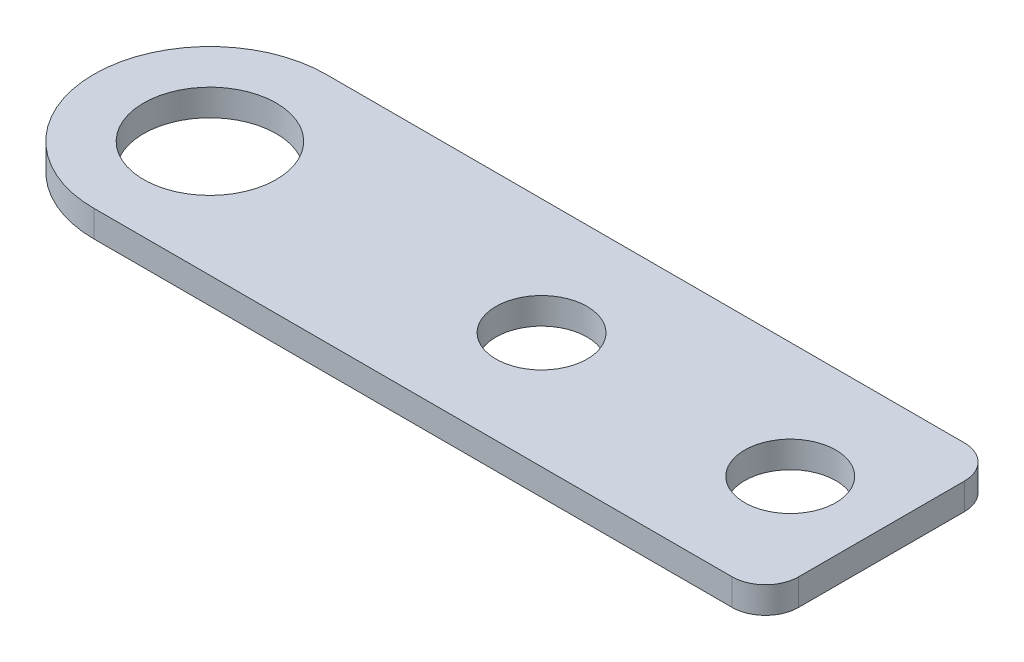
ISO-10303-21;
HEADER;
FILE_DESCRIPTION(('STEP AP214'),'2;1');
FILE_NAME('part.step','',(''),(''),'','','');
FILE_SCHEMA(('AUTOMOTIVE_DESIGN { 1 0 10303 214 1 1 1 1 }'));
ENDSEC;
DATA;
#1=APPLICATION_CONTEXT('core data for automotive mechanical design processes');
#2=APPLICATION_PROTOCOL_DEFINITION('international standard','automotive_design',2000,#1);
#3=PRODUCT_CONTEXT('',#1,'mechanical');
#4=PRODUCT('Part','Part','',(#3));
#5=PRODUCT_RELATED_PRODUCT_CATEGORY('part','',(#4));
#6=PRODUCT_DEFINITION_FORMATION('','',#4);
#7=PRODUCT_DEFINITION_CONTEXT('part definition',#1,'design');
#8=PRODUCT_DEFINITION('design','',#6,#7);
#9=PRODUCT_DEFINITION_SHAPE('','',#8);
#10=(LENGTH_UNIT() NAMED_UNIT(*) SI_UNIT(.MILLI.,.METRE.));
#11=(NAMED_UNIT(*) PLANE_ANGLE_UNIT() SI_UNIT($,.RADIAN.));
#12=(NAMED_UNIT(*) SI_UNIT($,.STERADIAN.) SOLID_ANGLE_UNIT());
#13=UNCERTAINTY_MEASURE_WITH_UNIT(LENGTH_MEASURE(1.E-05),#10,'distance_accuracy_value','');
#14=(GEOMETRIC_REPRESENTATION_CONTEXT(3) GLOBAL_UNCERTAINTY_ASSIGNED_CONTEXT((#13)) GLOBAL_UNIT_ASSIGNED_CONTEXT((#10,
#11,#12)) REPRESENTATION_CONTEXT('',''));
#15=CARTESIAN_POINT('',(0.,0.,0.));
#16=DIRECTION('',(0.,0.,1.));
#17=DIRECTION('',(1.,0.,0.));
#18=AXIS2_PLACEMENT_3D('',#15,#16,#17);
#19=CARTESIAN_POINT('',(-7.67572044652005,0.8,-7.00000000000001));
#20=DIRECTION('',(0.,1.,0.));
#21=DIRECTION('',(0.,0.,1.));
#22=AXIS2_PLACEMENT_3D('',#19,#20,#21);
#23=PLANE('',#22);
#24=CARTESIAN_POINT('',(0.,0.800000000000004,0.));
#25=DIRECTION('',(0.,-1.,0.));
#26=DIRECTION('',(0.,0.,-1.));
#27=AXIS2_PLACEMENT_3D('',#24,#25,#26);
#28=CIRCLE('',#27,3.99999999999999);
#29=CARTESIAN_POINT('',(0.,0.800000000000004,-3.99999999999999));
#30=VERTEX_POINT('',#29);
#31=EDGE_CURVE('E248',#30,#30,#28,.T.);
#32=ORIENTED_EDGE('',*,*,#31,.T.);
#33=EDGE_LOOP('',(#32));
#34=FACE_BOUND('',#33,.T.);
#35=CARTESIAN_POINT('',(35.,0.800000000000004,0.));
#36=DIRECTION('',(0.,-1.,0.));
#37=DIRECTION('',(0.,0.,-1.));
#38=AXIS2_PLACEMENT_3D('',#35,#36,#37);
#39=CIRCLE('',#38,2.74999999999999);
#40=CARTESIAN_POINT('',(35.,0.800000000000004,-2.74999999999999));
#41=VERTEX_POINT('',#40);
#42=EDGE_CURVE('E241',#41,#41,#39,.T.);
#43=ORIENTED_EDGE('',*,*,#42,.T.);
#44=EDGE_LOOP('',(#43));
#45=FACE_BOUND('',#44,.T.);
#46=DIRECTION('',(-1.,0.,0.));
#47=VECTOR('',#46,1.);
#48=CARTESIAN_POINT('',(38.5,0.8,7.));
#49=LINE('',#48,#47);
#50=CARTESIAN_POINT('',(0.,0.8,7.));
#51=VERTEX_POINT('',#50);
#52=CARTESIAN_POINT('',(38.4999999999998,0.8,7.));
#53=VERTEX_POINT('',#52);
#54=EDGE_CURVE('E149',#51,#53,#49,.F.);
#55=ORIENTED_EDGE('',*,*,#54,.T.);
#56=CARTESIAN_POINT('',(38.4999999999998,0.8,4.99999999999985));
#57=DIRECTION('',(0.,1.,0.));
#58=DIRECTION('',(0.,0.,1.));
#59=AXIS2_PLACEMENT_3D('',#56,#57,#58);
#60=CIRCLE('',#59,2.00000000000015);
#61=CARTESIAN_POINT('',(40.5,0.8,4.99999999999984));
#62=VERTEX_POINT('',#61);
#63=EDGE_CURVE('E54',#53,#62,#60,.T.);
#64=ORIENTED_EDGE('',*,*,#63,.T.);
#65=DIRECTION('',(0.,0.,1.));
#66=VECTOR('',#65,1.);
#67=CARTESIAN_POINT('',(40.5,0.8,-4.99999999999996));
#68=LINE('',#67,#66);
#69=CARTESIAN_POINT('',(40.5,0.8,-4.99999999999984));
#70=VERTEX_POINT('',#69);
#71=EDGE_CURVE('E148',#62,#70,#68,.F.);
#72=ORIENTED_EDGE('',*,*,#71,.T.);
#73=CARTESIAN_POINT('',(38.4999999999998,0.8,-4.99999999999984));
#74=DIRECTION('',(0.,1.,0.));
#75=DIRECTION('',(0.,0.,1.));
#76=AXIS2_PLACEMENT_3D('',#73,#74,#75);
#77=CIRCLE('',#76,2.00000000000015);
#78=CARTESIAN_POINT('',(38.4999999999998,0.8,-7.));
#79=VERTEX_POINT('',#78);
#80=EDGE_CURVE('E61',#70,#79,#77,.T.);
#81=ORIENTED_EDGE('',*,*,#80,.T.);
#82=DIRECTION('',(1.,0.,0.));
#83=VECTOR('',#82,1.);
#84=CARTESIAN_POINT('',(0.,0.8,-7.));
#85=LINE('',#84,#83);
#86=CARTESIAN_POINT('',(0.,0.8,-7.));
#87=VERTEX_POINT('',#86);
#88=EDGE_CURVE('E122',#79,#87,#85,.F.);
#89=ORIENTED_EDGE('',*,*,#88,.T.);
#90=CARTESIAN_POINT('',(0.,0.8,0.));
#91=DIRECTION('',(0.,-1.,0.));
#92=DIRECTION('',(0.,0.,1.));
#93=AXIS2_PLACEMENT_3D('',#90,#91,#92);
#94=CIRCLE('',#93,7.);
#95=EDGE_CURVE('E126',#87,#51,#94,.F.);
#96=ORIENTED_EDGE('',*,*,#95,.T.);
#97=EDGE_LOOP('',(#55,#64,#72,#81,#89,#96));
#98=FACE_BOUND('',#97,.T.);
#99=CARTESIAN_POINT('',(20.,0.800000000000004,0.));
#100=DIRECTION('',(0.,-1.,0.));
#101=DIRECTION('',(0.,0.,-1.));
#102=AXIS2_PLACEMENT_3D('',#99,#100,#101);
#103=CIRCLE('',#102,2.74999999999999);
#104=CARTESIAN_POINT('',(20.,0.800000000000004,-2.74999999999999));
#105=VERTEX_POINT('',#104);
#106=EDGE_CURVE('E110',#105,#105,#103,.T.);
#107=ORIENTED_EDGE('',*,*,#106,.T.);
#108=EDGE_LOOP('',(#107));
#109=FACE_BOUND('',#108,.T.);
#110=ADVANCED_FACE('F46',(#34,#45,#98,#109),#23,.T.);
#111=CARTESIAN_POINT('',(0.,-0.8,-7.));
#112=DIRECTION('',(0.,0.,-1.));
#113=DIRECTION('',(0.,1.,0.));
#114=AXIS2_PLACEMENT_3D('',#111,#112,#113);
#115=PLANE('',#114);
#116=ORIENTED_EDGE('',*,*,#88,.F.);
#117=DIRECTION('',(0.,-1.,0.));
#118=VECTOR('',#117,1.);
#119=CARTESIAN_POINT('',(38.4999999999998,-0.8,-7.));
#120=LINE('',#119,#118);
#121=CARTESIAN_POINT('',(38.4999999999998,-0.8,-7.));
#122=VERTEX_POINT('',#121);
#123=EDGE_CURVE('E12',#79,#122,#120,.T.);
#124=ORIENTED_EDGE('',*,*,#123,.T.);
#125=DIRECTION('',(-1.,0.,0.));
#126=VECTOR('',#125,1.);
#127=CARTESIAN_POINT('',(38.5,-0.8,-7.));
#128=LINE('',#127,#126);
#129=CARTESIAN_POINT('',(0.,-0.8,-7.));
#130=VERTEX_POINT('',#129);
#131=EDGE_CURVE('E102',#122,#130,#128,.T.);
#132=ORIENTED_EDGE('',*,*,#131,.T.);
#133=DIRECTION('',(0.,1.,0.));
#134=VECTOR('',#133,1.);
#135=CARTESIAN_POINT('',(0.,-0.8,-7.));
#136=LINE('',#135,#134);
#137=EDGE_CURVE('E106',#87,#130,#136,.F.);
#138=ORIENTED_EDGE('',*,*,#137,.F.);
#139=EDGE_LOOP('',(#116,#124,#132,#138));
#140=FACE_BOUND('',#139,.T.);
#141=ADVANCED_FACE('F104',(#140),#115,.T.);
#142=CARTESIAN_POINT('',(0.,0.8,0.));
#143=DIRECTION('',(0.,-1.,0.));
#144=DIRECTION('',(0.,0.,1.));
#145=AXIS2_PLACEMENT_3D('',#142,#143,#144);
#146=CYLINDRICAL_SURFACE('',#145,7.);
#147=CARTESIAN_POINT('',(0.,-0.8,0.));
#148=DIRECTION('',(0.,1.,0.));
#149=DIRECTION('',(0.,0.,-1.));
#150=AXIS2_PLACEMENT_3D('',#147,#148,#149);
#151=CIRCLE('',#150,7.);
#152=CARTESIAN_POINT('',(0.,-0.8,7.));
#153=VERTEX_POINT('',#152);
#154=EDGE_CURVE('E113',#130,#153,#151,.T.);
#155=ORIENTED_EDGE('',*,*,#154,.T.);
#156=DIRECTION('',(0.,1.,0.));
#157=VECTOR('',#156,1.);
#158=CARTESIAN_POINT('',(0.,-0.8,7.));
#159=LINE('',#158,#157);
#160=EDGE_CURVE('E121',#51,#153,#159,.F.);
#161=ORIENTED_EDGE('',*,*,#160,.F.);
#162=ORIENTED_EDGE('',*,*,#95,.F.);
#163=ORIENTED_EDGE('',*,*,#137,.T.);
#164=EDGE_LOOP('',(#155,#161,#162,#163));
#165=FACE_BOUND('',#164,.T.);
#166=ADVANCED_FACE('F125',(#165),#146,.T.);
#167=CARTESIAN_POINT('',(38.5,-0.8,7.));
#168=DIRECTION('',(0.,0.,1.));
#169=DIRECTION('',(0.,1.,0.));
#170=AXIS2_PLACEMENT_3D('',#167,#168,#169);
#171=PLANE('',#170);
#172=DIRECTION('',(1.,0.,0.));
#173=VECTOR('',#172,1.);
#174=CARTESIAN_POINT('',(0.,-0.8,7.));
#175=LINE('',#174,#173);
#176=CARTESIAN_POINT('',(38.4999999999998,-0.8,7.));
#177=VERTEX_POINT('',#176);
#178=EDGE_CURVE('E116',#153,#177,#175,.T.);
#179=ORIENTED_EDGE('',*,*,#178,.T.);
#180=DIRECTION('',(0.,-1.,0.));
#181=VECTOR('',#180,1.);
#182=CARTESIAN_POINT('',(38.5,-0.8,7.));
#183=LINE('',#182,#181);
#184=EDGE_CURVE('E69',#177,#53,#183,.F.);
#185=ORIENTED_EDGE('',*,*,#184,.T.);
#186=ORIENTED_EDGE('',*,*,#54,.F.);
#187=ORIENTED_EDGE('',*,*,#160,.T.);
#188=EDGE_LOOP('',(#179,#185,#186,#187));
#189=FACE_BOUND('',#188,.T.);
#190=ADVANCED_FACE('F168',(#189),#171,.T.);
#191=CARTESIAN_POINT('',(40.5,-0.8,-5.));
#192=DIRECTION('',(1.,0.,0.));
#193=DIRECTION('',(0.,1.,0.));
#194=AXIS2_PLACEMENT_3D('',#191,#192,#193);
#195=PLANE('',#194);
#196=ORIENTED_EDGE('',*,*,#71,.F.);
#197=DIRECTION('',(0.,-1.,0.));
#198=VECTOR('',#197,1.);
#199=CARTESIAN_POINT('',(40.5,-0.8,4.99999999999985));
#200=LINE('',#199,#198);
#201=CARTESIAN_POINT('',(40.5,-0.8,4.99999999999985));
#202=VERTEX_POINT('',#201);
#203=EDGE_CURVE('E156',#62,#202,#200,.T.);
#204=ORIENTED_EDGE('',*,*,#203,.T.);
#205=DIRECTION('',(0.,0.,-1.));
#206=VECTOR('',#205,1.);
#207=CARTESIAN_POINT('',(40.5,-0.8,4.99999999999995));
#208=LINE('',#207,#206);
#209=CARTESIAN_POINT('',(40.5,-0.8,-4.99999999999984));
#210=VERTEX_POINT('',#209);
#211=EDGE_CURVE('E160',#202,#210,#208,.T.);
#212=ORIENTED_EDGE('',*,*,#211,.T.);
#213=DIRECTION('',(0.,-1.,0.));
#214=VECTOR('',#213,1.);
#215=CARTESIAN_POINT('',(40.5,-0.8,-5.));
#216=LINE('',#215,#214);
#217=EDGE_CURVE('E158',#210,#70,#216,.F.);
#218=ORIENTED_EDGE('',*,*,#217,.T.);
#219=EDGE_LOOP('',(#196,#204,#212,#218));
#220=FACE_BOUND('',#219,.T.);
#221=ADVANCED_FACE('F154',(#220),#195,.T.);
#222=CARTESIAN_POINT('',(-7.67572044652004,-0.8,-7.00000000000001));
#223=DIRECTION('',(0.,-1.,0.));
#224=DIRECTION('',(1.,0.,0.));
#225=AXIS2_PLACEMENT_3D('',#222,#223,#224);
#226=PLANE('',#225);
#227=CARTESIAN_POINT('',(0.,-0.800000000000001,0.));
#228=DIRECTION('',(0.,-1.,0.));
#229=DIRECTION('',(0.,0.,-1.));
#230=AXIS2_PLACEMENT_3D('',#227,#228,#229);
#231=CIRCLE('',#230,3.99999999999999);
#232=CARTESIAN_POINT('',(0.,-0.800000000000001,-3.99999999999999));
#233=VERTEX_POINT('',#232);
#234=EDGE_CURVE('E232',#233,#233,#231,.T.);
#235=ORIENTED_EDGE('',*,*,#234,.F.);
#236=EDGE_LOOP('',(#235));
#237=FACE_BOUND('',#236,.T.);
#238=CARTESIAN_POINT('',(35.,-0.800000000000001,0.));
#239=DIRECTION('',(0.,-1.,0.));
#240=DIRECTION('',(0.,0.,-1.));
#241=AXIS2_PLACEMENT_3D('',#238,#239,#240);
#242=CIRCLE('',#241,2.74999999999999);
#243=CARTESIAN_POINT('',(35.,-0.800000000000001,-2.74999999999999));
#244=VERTEX_POINT('',#243);
#245=EDGE_CURVE('E236',#244,#244,#242,.T.);
#246=ORIENTED_EDGE('',*,*,#245,.F.);
#247=EDGE_LOOP('',(#246));
#248=FACE_BOUND('',#247,.T.);
#249=CARTESIAN_POINT('',(20.,-0.800000000000001,0.));
#250=DIRECTION('',(0.,-1.,0.));
#251=DIRECTION('',(0.,0.,-1.));
#252=AXIS2_PLACEMENT_3D('',#249,#250,#251);
#253=CIRCLE('',#252,2.74999999999999);
#254=CARTESIAN_POINT('',(20.,-0.800000000000001,-2.74999999999999));
#255=VERTEX_POINT('',#254);
#256=EDGE_CURVE('E239',#255,#255,#253,.T.);
#257=ORIENTED_EDGE('',*,*,#256,.F.);
#258=EDGE_LOOP('',(#257));
#259=FACE_BOUND('',#258,.T.);
#260=ORIENTED_EDGE('',*,*,#211,.F.);
#261=CARTESIAN_POINT('',(38.4999999999998,-0.8,4.99999999999985));
#262=DIRECTION('',(0.,-1.,0.));
#263=DIRECTION('',(0.,0.,-1.));
#264=AXIS2_PLACEMENT_3D('',#261,#262,#263);
#265=CIRCLE('',#264,2.00000000000015);
#266=EDGE_CURVE('E163',#202,#177,#265,.T.);
#267=ORIENTED_EDGE('',*,*,#266,.T.);
#268=ORIENTED_EDGE('',*,*,#178,.F.);
#269=ORIENTED_EDGE('',*,*,#154,.F.);
#270=ORIENTED_EDGE('',*,*,#131,.F.);
#271=CARTESIAN_POINT('',(38.4999999999998,-0.8,-4.99999999999984));
#272=DIRECTION('',(0.,-1.,0.));
#273=DIRECTION('',(0.,0.,-1.));
#274=AXIS2_PLACEMENT_3D('',#271,#272,#273);
#275=CIRCLE('',#274,2.00000000000015);
#276=EDGE_CURVE('E164',#122,#210,#275,.T.);
#277=ORIENTED_EDGE('',*,*,#276,.T.);
#278=EDGE_LOOP('',(#260,#267,#268,#269,#270,#277));
#279=FACE_BOUND('',#278,.T.);
#280=ADVANCED_FACE('F115',(#237,#248,#259,#279),#226,.T.);
#281=CARTESIAN_POINT('',(38.4999999999998,-0.8,4.99999999999985));
#282=DIRECTION('',(0.,-1.,0.));
#283=DIRECTION('',(0.,0.,-1.));
#284=AXIS2_PLACEMENT_3D('',#281,#282,#283);
#285=CYLINDRICAL_SURFACE('',#284,2.00000000000015);
#286=ORIENTED_EDGE('',*,*,#63,.F.);
#287=ORIENTED_EDGE('',*,*,#184,.F.);
#288=ORIENTED_EDGE('',*,*,#266,.F.);
#289=ORIENTED_EDGE('',*,*,#203,.F.);
#290=EDGE_LOOP('',(#286,#287,#288,#289));
#291=FACE_BOUND('',#290,.T.);
#292=ADVANCED_FACE('F162',(#291),#285,.T.);
#293=CARTESIAN_POINT('',(38.4999999999998,-0.8,-4.99999999999984));
#294=DIRECTION('',(0.,-1.,0.));
#295=DIRECTION('',(0.,0.,-1.));
#296=AXIS2_PLACEMENT_3D('',#293,#294,#295);
#297=CYLINDRICAL_SURFACE('',#296,2.00000000000015);
#298=ORIENTED_EDGE('',*,*,#80,.F.);
#299=ORIENTED_EDGE('',*,*,#217,.F.);
#300=ORIENTED_EDGE('',*,*,#276,.F.);
#301=ORIENTED_EDGE('',*,*,#123,.F.);
#302=EDGE_LOOP('',(#298,#299,#300,#301));
#303=FACE_BOUND('',#302,.T.);
#304=ADVANCED_FACE('F48',(#303),#297,.T.);
#305=CARTESIAN_POINT('',(20.,-0.8,0.));
#306=DIRECTION('',(0.,-1.,0.));
#307=DIRECTION('',(0.,0.,-1.));
#308=AXIS2_PLACEMENT_3D('',#305,#306,#307);
#309=CYLINDRICAL_SURFACE('',#308,2.74999999999999);
#310=ORIENTED_EDGE('',*,*,#106,.F.);
#311=EDGE_LOOP('',(#310));
#312=FACE_BOUND('',#311,.T.);
#313=ORIENTED_EDGE('',*,*,#256,.T.);
#314=EDGE_LOOP('',(#313));
#315=FACE_BOUND('',#314,.T.);
#316=ADVANCED_FACE('F202',(#312,#315),#309,.F.);
#317=CARTESIAN_POINT('',(35.,-0.8,0.));
#318=DIRECTION('',(0.,-1.,0.));
#319=DIRECTION('',(0.,0.,-1.));
#320=AXIS2_PLACEMENT_3D('',#317,#318,#319);
#321=CYLINDRICAL_SURFACE('',#320,2.74999999999999);
#322=ORIENTED_EDGE('',*,*,#42,.F.);
#323=EDGE_LOOP('',(#322));
#324=FACE_BOUND('',#323,.T.);
#325=ORIENTED_EDGE('',*,*,#245,.T.);
#326=EDGE_LOOP('',(#325));
#327=FACE_BOUND('',#326,.T.);
#328=ADVANCED_FACE('F207',(#324,#327),#321,.F.);
#329=CARTESIAN_POINT('',(0.,-0.8,0.));
#330=DIRECTION('',(0.,-1.,0.));
#331=DIRECTION('',(0.,0.,-1.));
#332=AXIS2_PLACEMENT_3D('',#329,#330,#331);
#333=CYLINDRICAL_SURFACE('',#332,3.99999999999999);
#334=ORIENTED_EDGE('',*,*,#31,.F.);
#335=EDGE_LOOP('',(#334));
#336=FACE_BOUND('',#335,.T.);
#337=ORIENTED_EDGE('',*,*,#234,.T.);
#338=EDGE_LOOP('',(#337));
#339=FACE_BOUND('',#338,.T.);
#340=ADVANCED_FACE('F251',(#336,#339),#333,.F.);
#341=CLOSED_SHELL('',(#110,#141,#166,#190,#221,#280,#292,#304,#316,#328,#340));
#342=MANIFOLD_SOLID_BREP('B2',#341);
#343=ADVANCED_BREP_SHAPE_REPRESENTATION('',(#18,#342),#14);
#344=SHAPE_DEFINITION_REPRESENTATION(#9,#343);
ENDSEC;
END-ISO-10303-21;
